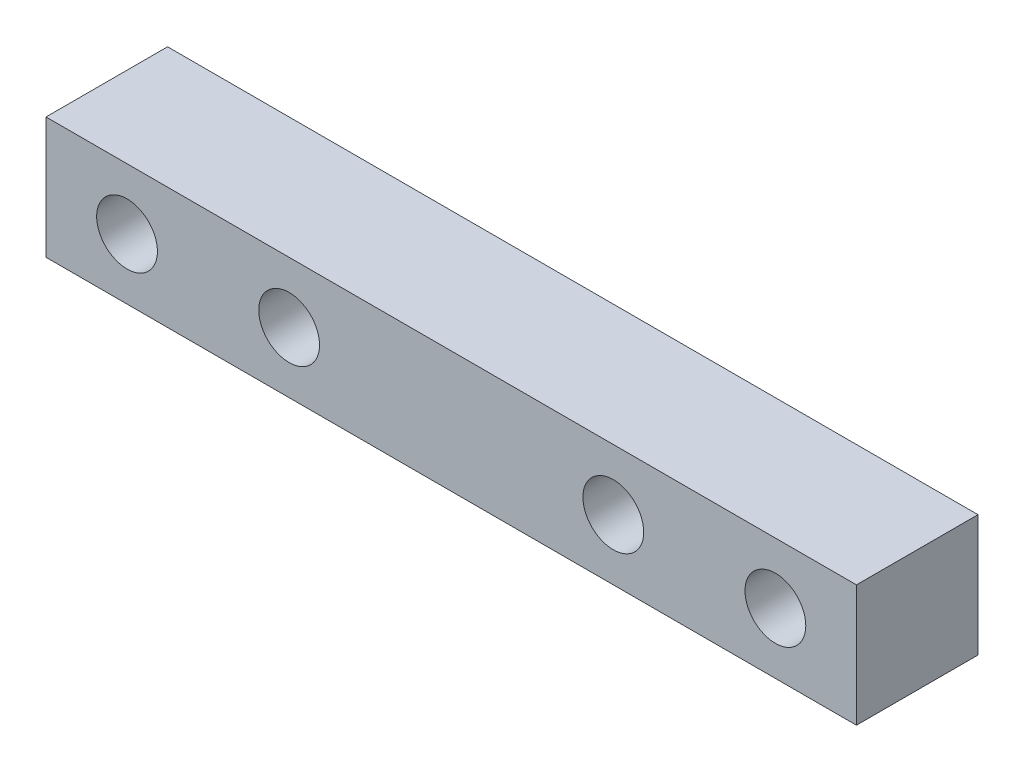
ISO-10303-21;
HEADER;
FILE_DESCRIPTION(('STEP AP214'),'2;1');
FILE_NAME('part.step','',(''),(''),'','','');
FILE_SCHEMA(('AUTOMOTIVE_DESIGN { 1 0 10303 214 1 1 1 1 }'));
ENDSEC;
DATA;
#1=APPLICATION_CONTEXT('core data for automotive mechanical design processes');
#2=APPLICATION_PROTOCOL_DEFINITION('international standard','automotive_design',2000,#1);
#3=PRODUCT_CONTEXT('',#1,'mechanical');
#4=PRODUCT('Part','Part','',(#3));
#5=PRODUCT_RELATED_PRODUCT_CATEGORY('part','',(#4));
#6=PRODUCT_DEFINITION_FORMATION('','',#4);
#7=PRODUCT_DEFINITION_CONTEXT('part definition',#1,'design');
#8=PRODUCT_DEFINITION('design','',#6,#7);
#9=PRODUCT_DEFINITION_SHAPE('','',#8);
#10=(LENGTH_UNIT() NAMED_UNIT(*) SI_UNIT(.MILLI.,.METRE.));
#11=(NAMED_UNIT(*) PLANE_ANGLE_UNIT() SI_UNIT($,.RADIAN.));
#12=(NAMED_UNIT(*) SI_UNIT($,.STERADIAN.) SOLID_ANGLE_UNIT());
#13=UNCERTAINTY_MEASURE_WITH_UNIT(LENGTH_MEASURE(1.E-05),#10,'distance_accuracy_value','');
#14=(GEOMETRIC_REPRESENTATION_CONTEXT(3) GLOBAL_UNCERTAINTY_ASSIGNED_CONTEXT((#13)) GLOBAL_UNIT_ASSIGNED_CONTEXT((#10,
#11,#12)) REPRESENTATION_CONTEXT('',''));
#15=CARTESIAN_POINT('',(0.,0.,0.));
#16=DIRECTION('',(0.,0.,1.));
#17=DIRECTION('',(1.,0.,0.));
#18=AXIS2_PLACEMENT_3D('',#15,#16,#17);
#19=CARTESIAN_POINT('',(0.,0.,6.));
#20=DIRECTION('',(0.,0.,1.));
#21=DIRECTION('',(1.,0.,0.));
#22=AXIS2_PLACEMENT_3D('',#19,#20,#21);
#23=PLANE('',#22);
#24=CARTESIAN_POINT('',(-16.,0.,6.));
#25=DIRECTION('',(0.,0.,1.));
#26=DIRECTION('',(1.,0.,0.));
#27=AXIS2_PLACEMENT_3D('',#24,#25,#26);
#28=CIRCLE('',#27,1.5);
#29=CARTESIAN_POINT('',(-14.5,0.,6.));
#30=VERTEX_POINT('',#29);
#31=EDGE_CURVE('E131',#30,#30,#28,.T.);
#32=ORIENTED_EDGE('',*,*,#31,.F.);
#33=EDGE_LOOP('',(#32));
#34=FACE_BOUND('',#33,.T.);
#35=CARTESIAN_POINT('',(-8.,0.,6.));
#36=DIRECTION('',(0.,0.,1.));
#37=DIRECTION('',(1.,0.,0.));
#38=AXIS2_PLACEMENT_3D('',#35,#36,#37);
#39=CIRCLE('',#38,1.5);
#40=CARTESIAN_POINT('',(-6.5,0.,6.));
#41=VERTEX_POINT('',#40);
#42=EDGE_CURVE('E125',#41,#41,#39,.T.);
#43=ORIENTED_EDGE('',*,*,#42,.F.);
#44=EDGE_LOOP('',(#43));
#45=FACE_BOUND('',#44,.T.);
#46=CARTESIAN_POINT('',(8.,0.,6.));
#47=DIRECTION('',(0.,0.,1.));
#48=DIRECTION('',(1.,0.,0.));
#49=AXIS2_PLACEMENT_3D('',#46,#47,#48);
#50=CIRCLE('',#49,1.5);
#51=CARTESIAN_POINT('',(9.5,0.,6.));
#52=VERTEX_POINT('',#51);
#53=EDGE_CURVE('E119',#52,#52,#50,.T.);
#54=ORIENTED_EDGE('',*,*,#53,.F.);
#55=EDGE_LOOP('',(#54));
#56=FACE_BOUND('',#55,.T.);
#57=CARTESIAN_POINT('',(16.,0.,6.));
#58=DIRECTION('',(0.,0.,1.));
#59=DIRECTION('',(1.,0.,0.));
#60=AXIS2_PLACEMENT_3D('',#57,#58,#59);
#61=CIRCLE('',#60,1.5);
#62=CARTESIAN_POINT('',(17.5,0.,6.));
#63=VERTEX_POINT('',#62);
#64=EDGE_CURVE('E113',#63,#63,#61,.T.);
#65=ORIENTED_EDGE('',*,*,#64,.F.);
#66=EDGE_LOOP('',(#65));
#67=FACE_BOUND('',#66,.T.);
#68=DIRECTION('',(0.,-1.,0.));
#69=VECTOR('',#68,1.);
#70=CARTESIAN_POINT('',(-20.,-3.,6.));
#71=LINE('',#70,#69);
#72=CARTESIAN_POINT('',(-20.,3.,6.));
#73=VERTEX_POINT('',#72);
#74=CARTESIAN_POINT('',(-20.,-3.,6.));
#75=VERTEX_POINT('',#74);
#76=EDGE_CURVE('E87',#73,#75,#71,.T.);
#77=ORIENTED_EDGE('',*,*,#76,.T.);
#78=DIRECTION('',(1.,0.,0.));
#79=VECTOR('',#78,1.);
#80=CARTESIAN_POINT('',(20.,-3.,6.));
#81=LINE('',#80,#79);
#82=CARTESIAN_POINT('',(20.,-3.,6.));
#83=VERTEX_POINT('',#82);
#84=EDGE_CURVE('E83',#75,#83,#81,.T.);
#85=ORIENTED_EDGE('',*,*,#84,.T.);
#86=DIRECTION('',(0.,1.,0.));
#87=VECTOR('',#86,1.);
#88=CARTESIAN_POINT('',(20.,-3.,6.));
#89=LINE('',#88,#87);
#90=CARTESIAN_POINT('',(20.,3.,6.));
#91=VERTEX_POINT('',#90);
#92=EDGE_CURVE('E85',#83,#91,#89,.T.);
#93=ORIENTED_EDGE('',*,*,#92,.T.);
#94=DIRECTION('',(-1.,0.,0.));
#95=VECTOR('',#94,1.);
#96=CARTESIAN_POINT('',(20.,3.,6.));
#97=LINE('',#96,#95);
#98=EDGE_CURVE('E53',#91,#73,#97,.T.);
#99=ORIENTED_EDGE('',*,*,#98,.T.);
#100=EDGE_LOOP('',(#77,#85,#93,#99));
#101=FACE_BOUND('',#100,.T.);
#102=ADVANCED_FACE('F36',(#34,#45,#56,#67,#101),#23,.T.);
#103=CARTESIAN_POINT('',(0.,0.,0.));
#104=DIRECTION('',(0.,0.,1.));
#105=DIRECTION('',(1.,0.,0.));
#106=AXIS2_PLACEMENT_3D('',#103,#104,#105);
#107=PLANE('',#106);
#108=CARTESIAN_POINT('',(-16.,0.,0.));
#109=DIRECTION('',(0.,0.,1.));
#110=DIRECTION('',(1.,0.,0.));
#111=AXIS2_PLACEMENT_3D('',#108,#109,#110);
#112=CIRCLE('',#111,1.5);
#113=CARTESIAN_POINT('',(-14.5,0.,0.));
#114=VERTEX_POINT('',#113);
#115=EDGE_CURVE('E102',#114,#114,#112,.T.);
#116=ORIENTED_EDGE('',*,*,#115,.T.);
#117=EDGE_LOOP('',(#116));
#118=FACE_BOUND('',#117,.T.);
#119=CARTESIAN_POINT('',(-8.,0.,0.));
#120=DIRECTION('',(0.,0.,1.));
#121=DIRECTION('',(1.,0.,0.));
#122=AXIS2_PLACEMENT_3D('',#119,#120,#121);
#123=CIRCLE('',#122,1.5);
#124=CARTESIAN_POINT('',(-6.5,0.,0.));
#125=VERTEX_POINT('',#124);
#126=EDGE_CURVE('E128',#125,#125,#123,.T.);
#127=ORIENTED_EDGE('',*,*,#126,.T.);
#128=EDGE_LOOP('',(#127));
#129=FACE_BOUND('',#128,.T.);
#130=CARTESIAN_POINT('',(8.,0.,0.));
#131=DIRECTION('',(0.,0.,1.));
#132=DIRECTION('',(1.,0.,0.));
#133=AXIS2_PLACEMENT_3D('',#130,#131,#132);
#134=CIRCLE('',#133,1.5);
#135=CARTESIAN_POINT('',(9.5,0.,0.));
#136=VERTEX_POINT('',#135);
#137=EDGE_CURVE('E122',#136,#136,#134,.T.);
#138=ORIENTED_EDGE('',*,*,#137,.T.);
#139=EDGE_LOOP('',(#138));
#140=FACE_BOUND('',#139,.T.);
#141=CARTESIAN_POINT('',(16.,0.,0.));
#142=DIRECTION('',(0.,0.,1.));
#143=DIRECTION('',(1.,0.,0.));
#144=AXIS2_PLACEMENT_3D('',#141,#142,#143);
#145=CIRCLE('',#144,1.5);
#146=CARTESIAN_POINT('',(17.5,0.,0.));
#147=VERTEX_POINT('',#146);
#148=EDGE_CURVE('E116',#147,#147,#145,.T.);
#149=ORIENTED_EDGE('',*,*,#148,.T.);
#150=EDGE_LOOP('',(#149));
#151=FACE_BOUND('',#150,.T.);
#152=DIRECTION('',(0.,-1.,0.));
#153=VECTOR('',#152,1.);
#154=CARTESIAN_POINT('',(-20.,-3.,0.));
#155=LINE('',#154,#153);
#156=CARTESIAN_POINT('',(-20.,3.,0.));
#157=VERTEX_POINT('',#156);
#158=CARTESIAN_POINT('',(-20.,-3.,0.));
#159=VERTEX_POINT('',#158);
#160=EDGE_CURVE('E99',#157,#159,#155,.T.);
#161=ORIENTED_EDGE('',*,*,#160,.F.);
#162=DIRECTION('',(-1.,0.,0.));
#163=VECTOR('',#162,1.);
#164=CARTESIAN_POINT('',(20.,3.,0.));
#165=LINE('',#164,#163);
#166=CARTESIAN_POINT('',(20.,3.,0.));
#167=VERTEX_POINT('',#166);
#168=EDGE_CURVE('E76',#167,#157,#165,.T.);
#169=ORIENTED_EDGE('',*,*,#168,.F.);
#170=DIRECTION('',(0.,1.,0.));
#171=VECTOR('',#170,1.);
#172=CARTESIAN_POINT('',(20.,-3.,0.));
#173=LINE('',#172,#171);
#174=CARTESIAN_POINT('',(20.,-3.,0.));
#175=VERTEX_POINT('',#174);
#176=EDGE_CURVE('E70',#175,#167,#173,.T.);
#177=ORIENTED_EDGE('',*,*,#176,.F.);
#178=DIRECTION('',(1.,0.,0.));
#179=VECTOR('',#178,1.);
#180=CARTESIAN_POINT('',(20.,-3.,0.));
#181=LINE('',#180,#179);
#182=EDGE_CURVE('E91',#159,#175,#181,.T.);
#183=ORIENTED_EDGE('',*,*,#182,.F.);
#184=EDGE_LOOP('',(#161,#169,#177,#183));
#185=FACE_BOUND('',#184,.T.);
#186=ADVANCED_FACE('F110',(#118,#129,#140,#151,#185),#107,.F.);
#187=CARTESIAN_POINT('',(-20.,-3.,6.));
#188=DIRECTION('',(1.,0.,0.));
#189=DIRECTION('',(0.,0.,-1.));
#190=AXIS2_PLACEMENT_3D('',#187,#188,#189);
#191=PLANE('',#190);
#192=ORIENTED_EDGE('',*,*,#160,.T.);
#193=DIRECTION('',(0.,0.,-1.));
#194=VECTOR('',#193,1.);
#195=CARTESIAN_POINT('',(-20.,-3.,6.));
#196=LINE('',#195,#194);
#197=EDGE_CURVE('E11',#75,#159,#196,.T.);
#198=ORIENTED_EDGE('',*,*,#197,.F.);
#199=ORIENTED_EDGE('',*,*,#76,.F.);
#200=DIRECTION('',(0.,0.,-1.));
#201=VECTOR('',#200,1.);
#202=CARTESIAN_POINT('',(-20.,3.,6.));
#203=LINE('',#202,#201);
#204=EDGE_CURVE('E95',#73,#157,#203,.T.);
#205=ORIENTED_EDGE('',*,*,#204,.T.);
#206=EDGE_LOOP('',(#192,#198,#199,#205));
#207=FACE_BOUND('',#206,.T.);
#208=ADVANCED_FACE('F38',(#207),#191,.F.);
#209=CARTESIAN_POINT('',(20.,-3.,6.));
#210=DIRECTION('',(0.,1.,0.));
#211=DIRECTION('',(-1.,0.,0.));
#212=AXIS2_PLACEMENT_3D('',#209,#210,#211);
#213=PLANE('',#212);
#214=ORIENTED_EDGE('',*,*,#182,.T.);
#215=DIRECTION('',(0.,0.,-1.));
#216=VECTOR('',#215,1.);
#217=CARTESIAN_POINT('',(20.,-3.,6.));
#218=LINE('',#217,#216);
#219=EDGE_CURVE('E45',#83,#175,#218,.T.);
#220=ORIENTED_EDGE('',*,*,#219,.F.);
#221=ORIENTED_EDGE('',*,*,#84,.F.);
#222=ORIENTED_EDGE('',*,*,#197,.T.);
#223=EDGE_LOOP('',(#214,#220,#221,#222));
#224=FACE_BOUND('',#223,.T.);
#225=ADVANCED_FACE('F90',(#224),#213,.F.);
#226=CARTESIAN_POINT('',(20.,-3.,6.));
#227=DIRECTION('',(-1.,0.,0.));
#228=DIRECTION('',(0.,0.,1.));
#229=AXIS2_PLACEMENT_3D('',#226,#227,#228);
#230=PLANE('',#229);
#231=ORIENTED_EDGE('',*,*,#176,.T.);
#232=DIRECTION('',(0.,0.,-1.));
#233=VECTOR('',#232,1.);
#234=CARTESIAN_POINT('',(20.,3.,6.));
#235=LINE('',#234,#233);
#236=EDGE_CURVE('E92',#91,#167,#235,.T.);
#237=ORIENTED_EDGE('',*,*,#236,.F.);
#238=ORIENTED_EDGE('',*,*,#92,.F.);
#239=ORIENTED_EDGE('',*,*,#219,.T.);
#240=EDGE_LOOP('',(#231,#237,#238,#239));
#241=FACE_BOUND('',#240,.T.);
#242=ADVANCED_FACE('F93',(#241),#230,.F.);
#243=CARTESIAN_POINT('',(20.,3.,6.));
#244=DIRECTION('',(0.,-1.,0.));
#245=DIRECTION('',(1.,0.,0.));
#246=AXIS2_PLACEMENT_3D('',#243,#244,#245);
#247=PLANE('',#246);
#248=ORIENTED_EDGE('',*,*,#168,.T.);
#249=ORIENTED_EDGE('',*,*,#204,.F.);
#250=ORIENTED_EDGE('',*,*,#98,.F.);
#251=ORIENTED_EDGE('',*,*,#236,.T.);
#252=EDGE_LOOP('',(#248,#249,#250,#251));
#253=FACE_BOUND('',#252,.T.);
#254=ADVANCED_FACE('F107',(#253),#247,.F.);
#255=CARTESIAN_POINT('',(16.,0.,0.));
#256=DIRECTION('',(0.,0.,1.));
#257=DIRECTION('',(1.,0.,0.));
#258=AXIS2_PLACEMENT_3D('',#255,#256,#257);
#259=CYLINDRICAL_SURFACE('',#258,1.5);
#260=ORIENTED_EDGE('',*,*,#148,.F.);
#261=EDGE_LOOP('',(#260));
#262=FACE_BOUND('',#261,.T.);
#263=ORIENTED_EDGE('',*,*,#64,.T.);
#264=EDGE_LOOP('',(#263));
#265=FACE_BOUND('',#264,.T.);
#266=ADVANCED_FACE('F155',(#262,#265),#259,.F.);
#267=CARTESIAN_POINT('',(8.,0.,0.));
#268=DIRECTION('',(0.,0.,1.));
#269=DIRECTION('',(1.,0.,0.));
#270=AXIS2_PLACEMENT_3D('',#267,#268,#269);
#271=CYLINDRICAL_SURFACE('',#270,1.5);
#272=ORIENTED_EDGE('',*,*,#137,.F.);
#273=EDGE_LOOP('',(#272));
#274=FACE_BOUND('',#273,.T.);
#275=ORIENTED_EDGE('',*,*,#53,.T.);
#276=EDGE_LOOP('',(#275));
#277=FACE_BOUND('',#276,.T.);
#278=ADVANCED_FACE('F157',(#274,#277),#271,.F.);
#279=CARTESIAN_POINT('',(-8.,0.,0.));
#280=DIRECTION('',(0.,0.,1.));
#281=DIRECTION('',(1.,0.,0.));
#282=AXIS2_PLACEMENT_3D('',#279,#280,#281);
#283=CYLINDRICAL_SURFACE('',#282,1.5);
#284=ORIENTED_EDGE('',*,*,#126,.F.);
#285=EDGE_LOOP('',(#284));
#286=FACE_BOUND('',#285,.T.);
#287=ORIENTED_EDGE('',*,*,#42,.T.);
#288=EDGE_LOOP('',(#287));
#289=FACE_BOUND('',#288,.T.);
#290=ADVANCED_FACE('F142',(#286,#289),#283,.F.);
#291=CARTESIAN_POINT('',(-16.,0.,0.));
#292=DIRECTION('',(0.,0.,1.));
#293=DIRECTION('',(1.,0.,0.));
#294=AXIS2_PLACEMENT_3D('',#291,#292,#293);
#295=CYLINDRICAL_SURFACE('',#294,1.5);
#296=ORIENTED_EDGE('',*,*,#115,.F.);
#297=EDGE_LOOP('',(#296));
#298=FACE_BOUND('',#297,.T.);
#299=ORIENTED_EDGE('',*,*,#31,.T.);
#300=EDGE_LOOP('',(#299));
#301=FACE_BOUND('',#300,.T.);
#302=ADVANCED_FACE('F139',(#298,#301),#295,.F.);
#303=CLOSED_SHELL('',(#102,#186,#208,#225,#242,#254,#266,#278,#290,#302));
#304=MANIFOLD_SOLID_BREP('B2',#303);
#305=ADVANCED_BREP_SHAPE_REPRESENTATION('',(#18,#304),#14);
#306=SHAPE_DEFINITION_REPRESENTATION(#9,#305);
ENDSEC;
END-ISO-10303-21;
